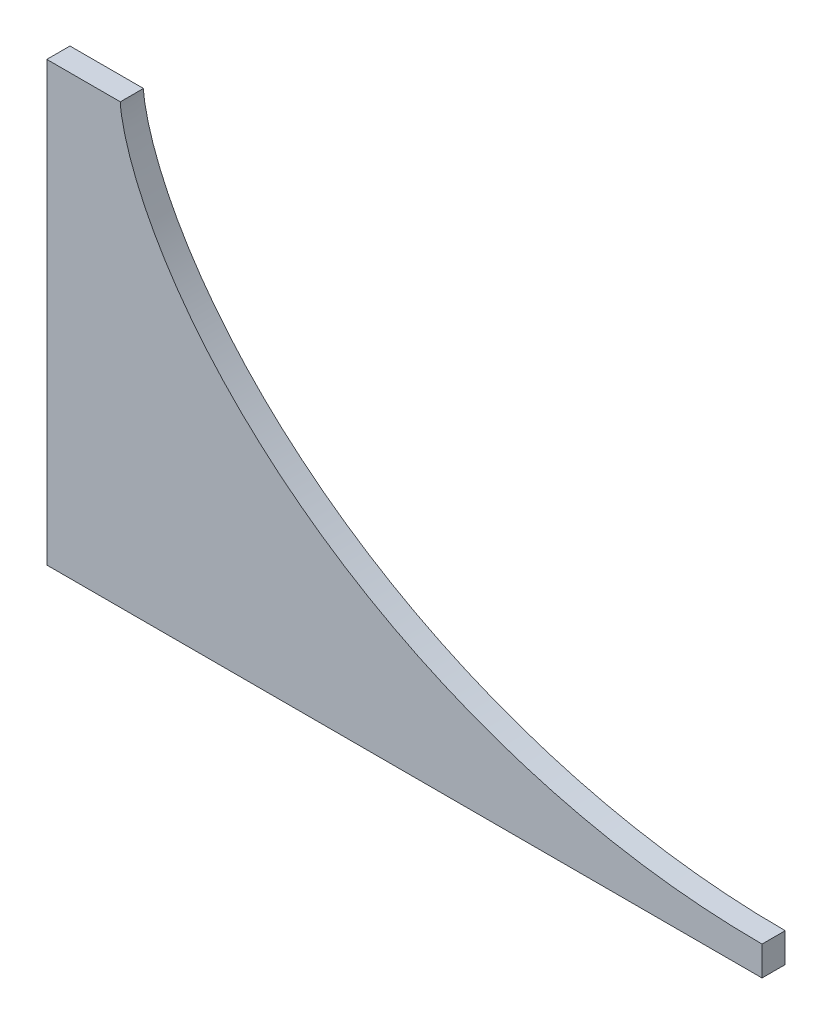
ISO-10303-21;
HEADER;
FILE_DESCRIPTION(('STEP AP214'),'2;1');
FILE_NAME('part.step','',(''),(''),'','','');
FILE_SCHEMA(('AUTOMOTIVE_DESIGN { 1 0 10303 214 1 1 1 1 }'));
ENDSEC;
DATA;
#1=APPLICATION_CONTEXT('core data for automotive mechanical design processes');
#2=APPLICATION_PROTOCOL_DEFINITION('international standard','automotive_design',2000,#1);
#3=PRODUCT_CONTEXT('',#1,'mechanical');
#4=PRODUCT('Part','Part','',(#3));
#5=PRODUCT_RELATED_PRODUCT_CATEGORY('part','',(#4));
#6=PRODUCT_DEFINITION_FORMATION('','',#4);
#7=PRODUCT_DEFINITION_CONTEXT('part definition',#1,'design');
#8=PRODUCT_DEFINITION('design','',#6,#7);
#9=PRODUCT_DEFINITION_SHAPE('','',#8);
#10=(LENGTH_UNIT() NAMED_UNIT(*) SI_UNIT(.MILLI.,.METRE.));
#11=(NAMED_UNIT(*) PLANE_ANGLE_UNIT() SI_UNIT($,.RADIAN.));
#12=(NAMED_UNIT(*) SI_UNIT($,.STERADIAN.) SOLID_ANGLE_UNIT());
#13=UNCERTAINTY_MEASURE_WITH_UNIT(LENGTH_MEASURE(1.E-05),#10,'distance_accuracy_value','');
#14=(GEOMETRIC_REPRESENTATION_CONTEXT(3) GLOBAL_UNCERTAINTY_ASSIGNED_CONTEXT((#13)) GLOBAL_UNIT_ASSIGNED_CONTEXT((#10,
#11,#12)) REPRESENTATION_CONTEXT('',''));
#15=CARTESIAN_POINT('',(0.,0.,0.));
#16=DIRECTION('',(0.,0.,1.));
#17=DIRECTION('',(1.,0.,0.));
#18=AXIS2_PLACEMENT_3D('',#15,#16,#17);
#19=CARTESIAN_POINT('',(-154.481439557848,-6.35,2.5));
#20=DIRECTION('',(0.,1.,0.));
#21=DIRECTION('',(0.,0.,1.));
#22=AXIS2_PLACEMENT_3D('',#19,#20,#21);
#23=PLANE('',#22);
#24=DIRECTION('',(1.,0.,0.));
#25=VECTOR('',#24,1.);
#26=CARTESIAN_POINT('',(-154.481439557848,-6.35,-2.5));
#27=LINE('',#26,#25);
#28=CARTESIAN_POINT('',(-154.481439557848,-6.35,-2.5));
#29=VERTEX_POINT('',#28);
#30=CARTESIAN_POINT('',(0.,-6.35,-2.5));
#31=VERTEX_POINT('',#30);
#32=EDGE_CURVE('E112',#29,#31,#27,.T.);
#33=ORIENTED_EDGE('',*,*,#32,.T.);
#34=DIRECTION('',(0.,0.,-1.));
#35=VECTOR('',#34,1.);
#36=CARTESIAN_POINT('',(0.,-6.35,2.5));
#37=LINE('',#36,#35);
#38=CARTESIAN_POINT('',(0.,-6.35,2.5));
#39=VERTEX_POINT('',#38);
#40=EDGE_CURVE('E11',#39,#31,#37,.T.);
#41=ORIENTED_EDGE('',*,*,#40,.F.);
#42=DIRECTION('',(1.,0.,0.));
#43=VECTOR('',#42,1.);
#44=CARTESIAN_POINT('',(-154.481439557848,-6.35,2.5));
#45=LINE('',#44,#43);
#46=CARTESIAN_POINT('',(-154.481439557848,-6.35,2.5));
#47=VERTEX_POINT('',#46);
#48=EDGE_CURVE('E125',#47,#39,#45,.T.);
#49=ORIENTED_EDGE('',*,*,#48,.F.);
#50=DIRECTION('',(0.,0.,-1.));
#51=VECTOR('',#50,1.);
#52=CARTESIAN_POINT('',(-154.481439557848,-6.35,2.5));
#53=LINE('',#52,#51);
#54=EDGE_CURVE('E105',#47,#29,#53,.T.);
#55=ORIENTED_EDGE('',*,*,#54,.T.);
#56=EDGE_LOOP('',(#33,#41,#49,#55));
#57=FACE_BOUND('',#56,.T.);
#58=ADVANCED_FACE('F35',(#57),#23,.F.);
#59=CARTESIAN_POINT('',(0.,-6.35,2.5));
#60=DIRECTION('',(-1.,0.,0.));
#61=DIRECTION('',(0.,0.,1.));
#62=AXIS2_PLACEMENT_3D('',#59,#60,#61);
#63=PLANE('',#62);
#64=DIRECTION('',(0.,1.,0.));
#65=VECTOR('',#64,1.);
#66=CARTESIAN_POINT('',(0.,-6.35,-2.5));
#67=LINE('',#66,#65);
#68=CARTESIAN_POINT('',(-3.2225814361377E-12,-4.70224750895336E-12,-2.5));
#69=VERTEX_POINT('',#68);
#70=EDGE_CURVE('E115',#31,#69,#67,.T.);
#71=ORIENTED_EDGE('',*,*,#70,.T.);
#72=DIRECTION('',(0.,0.,-1.));
#73=VECTOR('',#72,1.);
#74=CARTESIAN_POINT('',(-3.2225814361377E-12,-4.70224750895336E-12,2.5));
#75=LINE('',#74,#73);
#76=CARTESIAN_POINT('',(-3.2225814361377E-12,-4.70224750895336E-12,2.5));
#77=VERTEX_POINT('',#76);
#78=EDGE_CURVE('E43',#77,#69,#75,.T.);
#79=ORIENTED_EDGE('',*,*,#78,.F.);
#80=DIRECTION('',(0.,1.,0.));
#81=VECTOR('',#80,1.);
#82=CARTESIAN_POINT('',(0.,-6.35,2.5));
#83=LINE('',#82,#81);
#84=EDGE_CURVE('E85',#39,#77,#83,.T.);
#85=ORIENTED_EDGE('',*,*,#84,.F.);
#86=ORIENTED_EDGE('',*,*,#40,.T.);
#87=EDGE_LOOP('',(#71,#79,#85,#86));
#88=FACE_BOUND('',#87,.T.);
#89=ADVANCED_FACE('F144',(#88),#63,.F.);
#90=CARTESIAN_POINT('',(-3.2225814361377E-12,-4.70224750895336E-12,2.5));
#91=CARTESIAN_POINT('',(-0.315317675874365,-4.69539859235683E-12,2.5));
#92=CARTESIAN_POINT('',(-0.933202849632873,0.00181783838299916,2.5));
#93=CARTESIAN_POINT('',(-2.47711007242748,0.012428267788323,2.5));
#94=CARTESIAN_POINT('',(-4.35262006032526,0.0486470431453486,2.5));
#95=CARTESIAN_POINT('',(-7.3920123031344,0.139524343280071,2.5));
#96=CARTESIAN_POINT('',(-11.2783706242876,0.337947753305324,2.5));
#97=CARTESIAN_POINT('',(-15.8882256254125,0.683225410036247,2.5));
#98=CARTESIAN_POINT('',(-20.4355738967618,1.16504353497669,2.5));
#99=CARTESIAN_POINT('',(-24.3494332777357,1.67555944270521,2.5));
#100=CARTESIAN_POINT('',(-27.5868495583608,2.16600876140991,2.5));
#101=CARTESIAN_POINT('',(-30.1777357864607,2.59737994500898,2.5));
#102=CARTESIAN_POINT('',(-34.6941199005702,3.42054947239641,2.5));
#103=CARTESIAN_POINT('',(-41.1115016111657,4.79156365075683,2.5));
#104=CARTESIAN_POINT('',(-49.3653476835306,6.95424410733547,2.5));
#105=CARTESIAN_POINT('',(-59.340712587809,10.2401904320737,2.5));
#106=CARTESIAN_POINT('',(-69.08821911946,14.1503209254391,2.5));
#107=CARTESIAN_POINT('',(-78.562226683604,18.6846377219219,2.5));
#108=CARTESIAN_POINT('',(-87.7118299875412,23.8431383752298,2.5));
#109=CARTESIAN_POINT('',(-96.4812397590231,29.6258243584369,2.5));
#110=CARTESIAN_POINT('',(-104.806706423707,36.032698765365,2.5));
#111=CARTESIAN_POINT('',(-111.846477365907,42.3725486575921,2.5));
#112=CARTESIAN_POINT('',(-117.499907722486,48.2547797602766,2.5));
#113=CARTESIAN_POINT('',(-121.922980853757,53.4759848497702,2.5));
#114=CARTESIAN_POINT('',(-125.278396766732,57.8718013875356,2.5));
#115=CARTESIAN_POINT('',(-128.248792738205,62.2008761375249,2.5));
#116=CARTESIAN_POINT('',(-130.978665346063,66.6860112860701,2.5));
#117=CARTESIAN_POINT('',(-133.427089014441,71.3116257772703,2.5));
#118=CARTESIAN_POINT('',(-135.381511975903,75.692405852999,2.5));
#119=CARTESIAN_POINT('',(-136.709143665814,79.332808223133,2.5));
#120=CARTESIAN_POINT('',(-137.543893871889,82.1639404648542,2.5));
#121=CARTESIAN_POINT('',(-137.997774345649,84.0390428440237,2.5));
#122=CARTESIAN_POINT('',(-138.262733572859,85.3401653908125,2.5));
#123=CARTESIAN_POINT('',(-138.425196169405,86.3365819080089,2.5));
#124=CARTESIAN_POINT('',(-138.514302662478,87.0234266522157,2.5));
#125=CARTESIAN_POINT('',(-138.563362588891,87.5118332112473,2.5));
#126=CARTESIAN_POINT('',(-138.584504008792,87.7679735813505,2.5));
#127=CARTESIAN_POINT('',(-138.597757084802,87.9820401675203,2.5));
#128=CARTESIAN_POINT('',(-138.604893223751,88.1343321372545,2.5));
#129=CARTESIAN_POINT('',(-138.606439557848,88.2064800640192,2.5));
#130=CARTESIAN_POINT('',(-138.606439557848,88.2395999999881,2.5));
#131=B_SPLINE_CURVE_WITH_KNOTS('',4,(#90,#91,#92,#93,#94,#95,#96,#97,#98,#99,#100,#101,#102,
#103,#104,#105,#106,#107,#108,#109,#110,#111,#112,#113,#114,#115,#116,#117,#118,#119,#120,#121,
#122,#123,#124,#125,#126,#127,#128,#129,#130),.UNSPECIFIED.,.F.,.F.,(5,1,1,1,1,1,1,1,1,1,1,1,1,
1,1,1,1,1,1,1,1,1,1,1,1,1,1,1,1,1,1,1,1,1,1,1,1,5),(0.,0.00714685234854406,0.0142937046970881,
0.0278100161819966,0.041326327666905,0.0683589506367218,0.0953915690676178,0.122424187498514,
0.135940507742665,0.149456827986817,0.162973148230968,0.176489468475119,0.23055470638387,
0.2846199583885,0.338685154899743,0.392750482754099,0.446815660466263,0.500880994772262,
0.554946113506155,0.609011486457256,0.66307674621025,0.695881901929337,0.722914604188303,
0.749947156366306,0.776979831732039,0.804012310218606,0.831045129756175,0.857715393502871,
0.875737588033686,0.88378511771394,0.891832647394193,0.897460088824633,0.903087530255073,
0.90458889418278,0.906090258110487,0.907591622038194,0.908342304002048,0.909092985965901),.UNSPECIFIED.);
#132=DIRECTION('',(0.,0.,-1.));
#133=VECTOR('',#132,1.);
#134=SURFACE_OF_LINEAR_EXTRUSION('',#131,#133);
#135=CARTESIAN_POINT('',(-3.2225814361377E-12,-4.70224750895336E-12,-2.5));
#136=CARTESIAN_POINT('',(-0.315317675874365,-4.69539859235683E-12,-2.5));
#137=CARTESIAN_POINT('',(-0.933202849632873,0.00181783838299916,-2.5));
#138=CARTESIAN_POINT('',(-2.47711007242748,0.012428267788323,-2.5));
#139=CARTESIAN_POINT('',(-4.35262006032526,0.0486470431453486,-2.5));
#140=CARTESIAN_POINT('',(-7.3920123031344,0.139524343280071,-2.5));
#141=CARTESIAN_POINT('',(-11.2783706242876,0.337947753305324,-2.5));
#142=CARTESIAN_POINT('',(-15.8882256254125,0.683225410036247,-2.5));
#143=CARTESIAN_POINT('',(-20.4355738967618,1.16504353497669,-2.5));
#144=CARTESIAN_POINT('',(-24.3494332777357,1.67555944270521,-2.5));
#145=CARTESIAN_POINT('',(-27.5868495583608,2.16600876140991,-2.5));
#146=CARTESIAN_POINT('',(-30.1777357864607,2.59737994500898,-2.5));
#147=CARTESIAN_POINT('',(-34.6941199005702,3.42054947239641,-2.5));
#148=CARTESIAN_POINT('',(-41.1115016111657,4.79156365075683,-2.5));
#149=CARTESIAN_POINT('',(-49.3653476835306,6.95424410733547,-2.5));
#150=CARTESIAN_POINT('',(-59.340712587809,10.2401904320737,-2.5));
#151=CARTESIAN_POINT('',(-69.08821911946,14.1503209254391,-2.5));
#152=CARTESIAN_POINT('',(-78.562226683604,18.6846377219219,-2.5));
#153=CARTESIAN_POINT('',(-87.7118299875412,23.8431383752298,-2.5));
#154=CARTESIAN_POINT('',(-96.4812397590231,29.6258243584369,-2.5));
#155=CARTESIAN_POINT('',(-104.806706423707,36.032698765365,-2.5));
#156=CARTESIAN_POINT('',(-111.846477365907,42.3725486575921,-2.5));
#157=CARTESIAN_POINT('',(-117.499907722486,48.2547797602766,-2.5));
#158=CARTESIAN_POINT('',(-121.922980853757,53.4759848497702,-2.5));
#159=CARTESIAN_POINT('',(-125.278396766732,57.8718013875356,-2.5));
#160=CARTESIAN_POINT('',(-128.248792738205,62.2008761375249,-2.5));
#161=CARTESIAN_POINT('',(-130.978665346063,66.6860112860701,-2.5));
#162=CARTESIAN_POINT('',(-133.427089014441,71.3116257772703,-2.5));
#163=CARTESIAN_POINT('',(-135.381511975903,75.692405852999,-2.5));
#164=CARTESIAN_POINT('',(-136.709143665814,79.332808223133,-2.5));
#165=CARTESIAN_POINT('',(-137.543893871889,82.1639404648542,-2.5));
#166=CARTESIAN_POINT('',(-137.997774345649,84.0390428440237,-2.5));
#167=CARTESIAN_POINT('',(-138.262733572859,85.3401653908125,-2.5));
#168=CARTESIAN_POINT('',(-138.425196169405,86.3365819080089,-2.5));
#169=CARTESIAN_POINT('',(-138.514302662478,87.0234266522157,-2.5));
#170=CARTESIAN_POINT('',(-138.563362588891,87.5118332112473,-2.5));
#171=CARTESIAN_POINT('',(-138.584504008792,87.7679735813505,-2.5));
#172=CARTESIAN_POINT('',(-138.597757084802,87.9820401675203,-2.5));
#173=CARTESIAN_POINT('',(-138.604893223751,88.1343321372545,-2.5));
#174=CARTESIAN_POINT('',(-138.606439557848,88.2064800640192,-2.5));
#175=CARTESIAN_POINT('',(-138.606439557848,88.2395999999881,-2.5));
#176=B_SPLINE_CURVE_WITH_KNOTS('',4,(#135,#136,#137,#138,#139,#140,#141,#142,#143,#144,#145,
#146,#147,#148,#149,#150,#151,#152,#153,#154,#155,#156,#157,#158,#159,#160,#161,#162,#163,#164,
#165,#166,#167,#168,#169,#170,#171,#172,#173,#174,#175),.UNSPECIFIED.,.F.,.F.,(5,1,1,1,1,1,1,1,
1,1,1,1,1,1,1,1,1,1,1,1,1,1,1,1,1,1,1,1,1,1,1,1,1,1,1,1,1,5),(0.,0.00714685234854406,
0.0142937046970881,0.0278100161819966,0.041326327666905,0.0683589506367218,0.0953915690676178,
0.122424187498514,0.135940507742665,0.149456827986817,0.162973148230968,0.176489468475119,
0.23055470638387,0.2846199583885,0.338685154899743,0.392750482754099,0.446815660466263,
0.500880994772262,0.554946113506155,0.609011486457256,0.66307674621025,0.695881901929337,
0.722914604188303,0.749947156366306,0.776979831732039,0.804012310218606,0.831045129756175,
0.857715393502871,0.875737588033686,0.88378511771394,0.891832647394193,0.897460088824633,
0.903087530255073,0.90458889418278,0.906090258110487,0.907591622038194,0.908342304002048,
0.909092985965901),.UNSPECIFIED.);
#177=CARTESIAN_POINT('',(-138.606439557848,88.2395999999894,-2.5));
#178=VERTEX_POINT('',#177);
#179=EDGE_CURVE('E100',#69,#178,#176,.T.);
#180=ORIENTED_EDGE('',*,*,#179,.T.);
#181=DIRECTION('',(0.,0.,-1.));
#182=VECTOR('',#181,1.);
#183=CARTESIAN_POINT('',(-138.606439557848,88.2395999999894,2.5));
#184=LINE('',#183,#182);
#185=CARTESIAN_POINT('',(-138.606439557848,88.2395999999894,2.5));
#186=VERTEX_POINT('',#185);
#187=EDGE_CURVE('E97',#186,#178,#184,.T.);
#188=ORIENTED_EDGE('',*,*,#187,.F.);
#189=EDGE_CURVE('E89',#77,#186,#131,.T.);
#190=ORIENTED_EDGE('',*,*,#189,.F.);
#191=ORIENTED_EDGE('',*,*,#78,.T.);
#192=EDGE_LOOP('',(#180,#188,#190,#191));
#193=FACE_BOUND('',#192,.T.);
#194=ADVANCED_FACE('F98',(#193),#134,.F.);
#195=CARTESIAN_POINT('',(-138.606439557848,88.2395999999894,2.5));
#196=DIRECTION('',(0.,-1.,0.));
#197=DIRECTION('',(1.,0.,0.));
#198=AXIS2_PLACEMENT_3D('',#195,#196,#197);
#199=PLANE('',#198);
#200=DIRECTION('',(-1.,0.,0.));
#201=VECTOR('',#200,1.);
#202=CARTESIAN_POINT('',(-138.606439557848,88.2395999999894,-2.5));
#203=LINE('',#202,#201);
#204=CARTESIAN_POINT('',(-154.481439557848,88.2395999999879,-2.5));
#205=VERTEX_POINT('',#204);
#206=EDGE_CURVE('E71',#178,#205,#203,.T.);
#207=ORIENTED_EDGE('',*,*,#206,.T.);
#208=DIRECTION('',(0.,0.,-1.));
#209=VECTOR('',#208,1.);
#210=CARTESIAN_POINT('',(-154.481439557848,88.2395999999879,2.5));
#211=LINE('',#210,#209);
#212=CARTESIAN_POINT('',(-154.481439557848,88.2395999999879,2.5));
#213=VERTEX_POINT('',#212);
#214=EDGE_CURVE('E101',#213,#205,#211,.T.);
#215=ORIENTED_EDGE('',*,*,#214,.F.);
#216=DIRECTION('',(-1.,0.,0.));
#217=VECTOR('',#216,1.);
#218=CARTESIAN_POINT('',(-138.606439557848,88.2395999999894,2.5));
#219=LINE('',#218,#217);
#220=EDGE_CURVE('E93',#186,#213,#219,.T.);
#221=ORIENTED_EDGE('',*,*,#220,.F.);
#222=ORIENTED_EDGE('',*,*,#187,.T.);
#223=EDGE_LOOP('',(#207,#215,#221,#222));
#224=FACE_BOUND('',#223,.T.);
#225=ADVANCED_FACE('F103',(#224),#199,.F.);
#226=CARTESIAN_POINT('',(-154.481439557848,88.2395999999879,2.5));
#227=DIRECTION('',(1.,0.,0.));
#228=DIRECTION('',(0.,0.,-1.));
#229=AXIS2_PLACEMENT_3D('',#226,#227,#228);
#230=PLANE('',#229);
#231=DIRECTION('',(0.,-1.,0.));
#232=VECTOR('',#231,1.);
#233=CARTESIAN_POINT('',(-154.481439557848,88.2395999999879,-2.5));
#234=LINE('',#233,#232);
#235=EDGE_CURVE('E77',#205,#29,#234,.T.);
#236=ORIENTED_EDGE('',*,*,#235,.T.);
#237=ORIENTED_EDGE('',*,*,#54,.F.);
#238=DIRECTION('',(0.,-1.,0.));
#239=VECTOR('',#238,1.);
#240=CARTESIAN_POINT('',(-154.481439557848,88.2395999999879,2.5));
#241=LINE('',#240,#239);
#242=EDGE_CURVE('E51',#213,#47,#241,.T.);
#243=ORIENTED_EDGE('',*,*,#242,.F.);
#244=ORIENTED_EDGE('',*,*,#214,.T.);
#245=EDGE_LOOP('',(#236,#237,#243,#244));
#246=FACE_BOUND('',#245,.T.);
#247=ADVANCED_FACE('F133',(#246),#230,.F.);
#248=CARTESIAN_POINT('',(-84.411015264639,22.0598996205078,2.5));
#249=DIRECTION('',(0.,0.,-1.));
#250=DIRECTION('',(-1.,0.,0.));
#251=AXIS2_PLACEMENT_3D('',#248,#249,#250);
#252=PLANE('',#251);
#253=ORIENTED_EDGE('',*,*,#48,.T.);
#254=ORIENTED_EDGE('',*,*,#84,.T.);
#255=ORIENTED_EDGE('',*,*,#189,.T.);
#256=ORIENTED_EDGE('',*,*,#220,.T.);
#257=ORIENTED_EDGE('',*,*,#242,.T.);
#258=EDGE_LOOP('',(#253,#254,#255,#256,#257));
#259=FACE_BOUND('',#258,.T.);
#260=ADVANCED_FACE('F91',(#259),#252,.F.);
#261=CARTESIAN_POINT('',(-84.411015264639,22.0598996205078,-2.5));
#262=DIRECTION('',(0.,0.,-1.));
#263=DIRECTION('',(-1.,0.,0.));
#264=AXIS2_PLACEMENT_3D('',#261,#262,#263);
#265=PLANE('',#264);
#266=ORIENTED_EDGE('',*,*,#32,.F.);
#267=ORIENTED_EDGE('',*,*,#235,.F.);
#268=ORIENTED_EDGE('',*,*,#206,.F.);
#269=ORIENTED_EDGE('',*,*,#179,.F.);
#270=ORIENTED_EDGE('',*,*,#70,.F.);
#271=EDGE_LOOP('',(#266,#267,#268,#269,#270));
#272=FACE_BOUND('',#271,.T.);
#273=ADVANCED_FACE('F129',(#272),#265,.T.);
#274=CLOSED_SHELL('',(#58,#89,#194,#225,#247,#260,#273));
#275=MANIFOLD_SOLID_BREP('B2',#274);
#276=ADVANCED_BREP_SHAPE_REPRESENTATION('',(#18,#275),#14);
#277=SHAPE_DEFINITION_REPRESENTATION(#9,#276);
ENDSEC;
END-ISO-10303-21;
